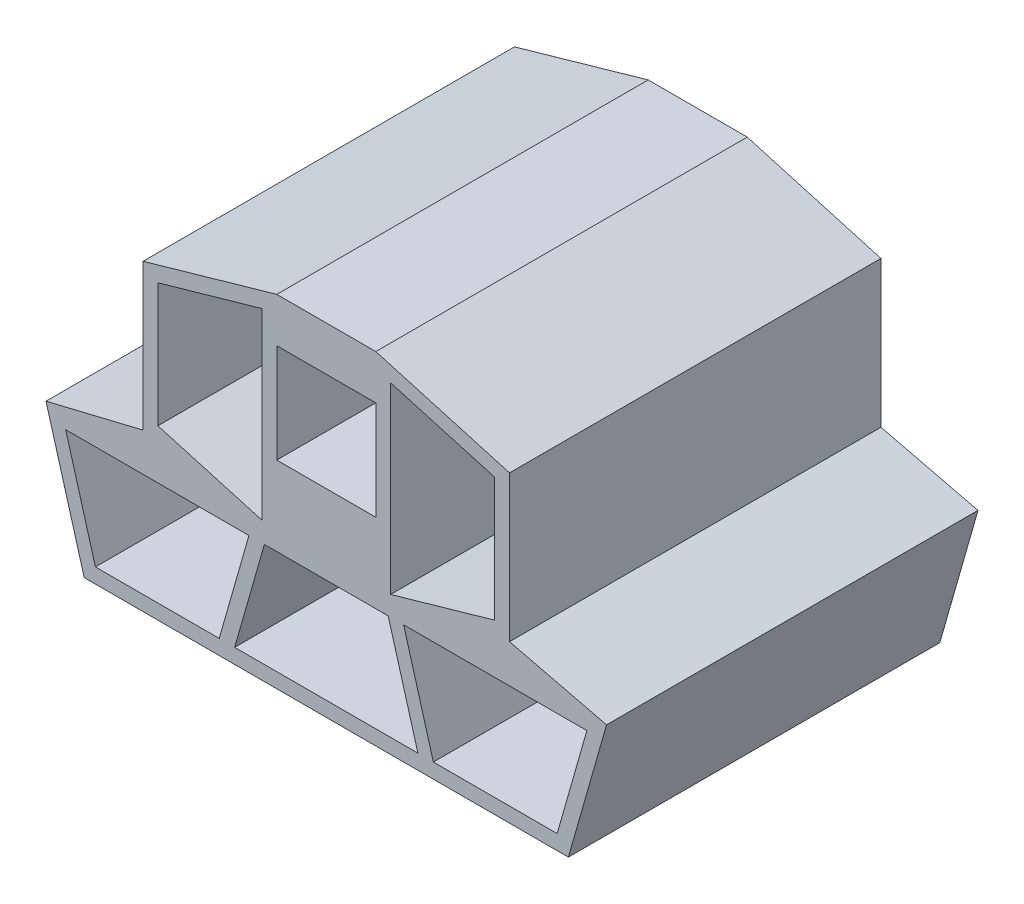
ISO-10303-21;
HEADER;
FILE_DESCRIPTION(('STEP AP214'),'2;1');
FILE_NAME('part.step','',(''),(''),'','','');
FILE_SCHEMA(('AUTOMOTIVE_DESIGN { 1 0 10303 214 1 1 1 1 }'));
ENDSEC;
DATA;
#1=APPLICATION_CONTEXT('core data for automotive mechanical design processes');
#2=APPLICATION_PROTOCOL_DEFINITION('international standard','automotive_design',2000,#1);
#3=PRODUCT_CONTEXT('',#1,'mechanical');
#4=PRODUCT('Part','Part','',(#3));
#5=PRODUCT_RELATED_PRODUCT_CATEGORY('part','',(#4));
#6=PRODUCT_DEFINITION_FORMATION('','',#4);
#7=PRODUCT_DEFINITION_CONTEXT('part definition',#1,'design');
#8=PRODUCT_DEFINITION('design','',#6,#7);
#9=PRODUCT_DEFINITION_SHAPE('','',#8);
#10=(LENGTH_UNIT() NAMED_UNIT(*) SI_UNIT(.MILLI.,.METRE.));
#11=(NAMED_UNIT(*) PLANE_ANGLE_UNIT() SI_UNIT($,.RADIAN.));
#12=(NAMED_UNIT(*) SI_UNIT($,.STERADIAN.) SOLID_ANGLE_UNIT());
#13=UNCERTAINTY_MEASURE_WITH_UNIT(LENGTH_MEASURE(1.E-05),#10,'distance_accuracy_value','');
#14=(GEOMETRIC_REPRESENTATION_CONTEXT(3) GLOBAL_UNCERTAINTY_ASSIGNED_CONTEXT((#13)) GLOBAL_UNIT_ASSIGNED_CONTEXT((#10,
#11,#12)) REPRESENTATION_CONTEXT('',''));
#15=CARTESIAN_POINT('',(0.,0.,0.));
#16=DIRECTION('',(0.,0.,1.));
#17=DIRECTION('',(1.,0.,0.));
#18=AXIS2_PLACEMENT_3D('',#15,#16,#17);
#19=CARTESIAN_POINT('',(0.,0.,75.));
#20=DIRECTION('',(0.,0.,1.));
#21=DIRECTION('',(1.,0.,0.));
#22=AXIS2_PLACEMENT_3D('',#19,#20,#21);
#23=PLANE('',#22);
#24=DIRECTION('',(-0.972006040902792,0.234955860638716,0.));
#25=VECTOR('',#24,1.);
#26=CARTESIAN_POINT('',(56.5972370479555,-23.,75.));
#27=LINE('',#26,#25);
#28=CARTESIAN_POINT('',(56.5972370479555,-23.,75.));
#29=VERTEX_POINT('',#28);
#30=CARTESIAN_POINT('',(37.,-18.2629042382631,75.));
#31=VERTEX_POINT('',#30);
#32=EDGE_CURVE('E524',#29,#31,#27,.T.);
#33=ORIENTED_EDGE('',*,*,#32,.T.);
#34=DIRECTION('',(0.,1.,0.));
#35=VECTOR('',#34,1.);
#36=CARTESIAN_POINT('',(37.,11.2629042382631,75.));
#37=LINE('',#36,#35);
#38=CARTESIAN_POINT('',(37.,11.2629042382631,75.));
#39=VERTEX_POINT('',#38);
#40=EDGE_CURVE('E528',#31,#39,#37,.T.);
#41=ORIENTED_EDGE('',*,*,#40,.T.);
#42=DIRECTION('',(-0.961523947640823,0.274721127897378,0.));
#43=VECTOR('',#42,1.);
#44=CARTESIAN_POINT('',(10.,18.9771899525488,75.));
#45=LINE('',#44,#43);
#46=CARTESIAN_POINT('',(10.,18.9771899525488,75.));
#47=VERTEX_POINT('',#46);
#48=EDGE_CURVE('E532',#39,#47,#45,.T.);
#49=ORIENTED_EDGE('',*,*,#48,.T.);
#50=DIRECTION('',(-1.,0.,0.));
#51=VECTOR('',#50,1.);
#52=CARTESIAN_POINT('',(10.,18.9771899525488,75.));
#53=LINE('',#52,#51);
#54=CARTESIAN_POINT('',(-10.,18.9771899525488,75.));
#55=VERTEX_POINT('',#54);
#56=EDGE_CURVE('E535',#47,#55,#53,.T.);
#57=ORIENTED_EDGE('',*,*,#56,.T.);
#58=DIRECTION('',(-0.961523947640823,-0.274721127897378,0.));
#59=VECTOR('',#58,1.);
#60=CARTESIAN_POINT('',(-10.,18.9771899525488,75.));
#61=LINE('',#60,#59);
#62=CARTESIAN_POINT('',(-37.,11.2629042382631,75.));
#63=VERTEX_POINT('',#62);
#64=EDGE_CURVE('E538',#55,#63,#61,.T.);
#65=ORIENTED_EDGE('',*,*,#64,.T.);
#66=DIRECTION('',(0.,-1.,0.));
#67=VECTOR('',#66,1.);
#68=CARTESIAN_POINT('',(-37.,11.2629042382631,75.));
#69=LINE('',#68,#67);
#70=CARTESIAN_POINT('',(-37.,-18.2629042382631,75.));
#71=VERTEX_POINT('',#70);
#72=EDGE_CURVE('E541',#63,#71,#69,.T.);
#73=ORIENTED_EDGE('',*,*,#72,.T.);
#74=DIRECTION('',(-0.972006040902792,-0.234955860638716,0.));
#75=VECTOR('',#74,1.);
#76=CARTESIAN_POINT('',(-56.5972370479555,-23.,75.));
#77=LINE('',#76,#75);
#78=CARTESIAN_POINT('',(-56.5972370479555,-23.,75.));
#79=VERTEX_POINT('',#78);
#80=EDGE_CURVE('E544',#71,#79,#77,.T.);
#81=ORIENTED_EDGE('',*,*,#80,.T.);
#82=DIRECTION('',(0.274721127897378,-0.961523947640823,0.));
#83=VECTOR('',#82,1.);
#84=CARTESIAN_POINT('',(-56.5972370479555,-23.,75.));
#85=LINE('',#84,#83);
#86=CARTESIAN_POINT('',(-48.8829513336697,-50.,75.));
#87=VERTEX_POINT('',#86);
#88=EDGE_CURVE('E547',#79,#87,#85,.T.);
#89=ORIENTED_EDGE('',*,*,#88,.T.);
#90=DIRECTION('',(1.,0.,0.));
#91=VECTOR('',#90,1.);
#92=CARTESIAN_POINT('',(-48.8829513336697,-50.,75.));
#93=LINE('',#92,#91);
#94=CARTESIAN_POINT('',(48.8829513336698,-50.,75.));
#95=VERTEX_POINT('',#94);
#96=EDGE_CURVE('E550',#87,#95,#93,.T.);
#97=ORIENTED_EDGE('',*,*,#96,.T.);
#98=DIRECTION('',(0.274721127897378,0.961523947640823,0.));
#99=VECTOR('',#98,1.);
#100=CARTESIAN_POINT('',(56.5972370479555,-23.,75.));
#101=LINE('',#100,#99);
#102=EDGE_CURVE('E553',#95,#29,#101,.T.);
#103=ORIENTED_EDGE('',*,*,#102,.T.);
#104=EDGE_LOOP('',(#33,#41,#49,#57,#65,#73,#81,#89,#97,#103));
#105=FACE_BOUND('',#104,.T.);
#106=DIRECTION('',(1.,0.,0.));
#107=VECTOR('',#106,1.);
#108=CARTESIAN_POINT('',(10.,-10.,75.));
#109=LINE('',#108,#107);
#110=CARTESIAN_POINT('',(-10.,-10.,75.));
#111=VERTEX_POINT('',#110);
#112=CARTESIAN_POINT('',(10.,-10.,75.));
#113=VERTEX_POINT('',#112);
#114=EDGE_CURVE('E484',#111,#113,#109,.T.);
#115=ORIENTED_EDGE('',*,*,#114,.F.);
#116=DIRECTION('',(0.,-1.,0.));
#117=VECTOR('',#116,1.);
#118=CARTESIAN_POINT('',(-10.,-10.,75.));
#119=LINE('',#118,#117);
#120=CARTESIAN_POINT('',(-10.,10.,75.));
#121=VERTEX_POINT('',#120);
#122=EDGE_CURVE('E481',#121,#111,#119,.T.);
#123=ORIENTED_EDGE('',*,*,#122,.F.);
#124=DIRECTION('',(-1.,0.,0.));
#125=VECTOR('',#124,1.);
#126=CARTESIAN_POINT('',(10.,10.,75.));
#127=LINE('',#126,#125);
#128=CARTESIAN_POINT('',(10.,10.,75.));
#129=VERTEX_POINT('',#128);
#130=EDGE_CURVE('E492',#129,#121,#127,.T.);
#131=ORIENTED_EDGE('',*,*,#130,.F.);
#132=DIRECTION('',(0.,1.,0.));
#133=VECTOR('',#132,1.);
#134=CARTESIAN_POINT('',(10.,-10.,75.));
#135=LINE('',#134,#133);
#136=EDGE_CURVE('E488',#113,#129,#135,.T.);
#137=ORIENTED_EDGE('',*,*,#136,.F.);
#138=EDGE_LOOP('',(#115,#123,#131,#137));
#139=FACE_BOUND('',#138,.T.);
#140=DIRECTION('',(0.274721127897378,-0.961523947640823,0.));
#141=VECTOR('',#140,1.);
#142=CARTESIAN_POINT('',(15.6200470954067,-26.,75.));
#143=LINE('',#142,#141);
#144=CARTESIAN_POINT('',(15.6200470954067,-26.,75.));
#145=VERTEX_POINT('',#144);
#146=CARTESIAN_POINT('',(21.6200470954067,-47.,75.));
#147=VERTEX_POINT('',#146);
#148=EDGE_CURVE('E441',#145,#147,#143,.T.);
#149=ORIENTED_EDGE('',*,*,#148,.F.);
#150=DIRECTION('',(-1.,0.,0.));
#151=VECTOR('',#150,1.);
#152=CARTESIAN_POINT('',(15.6200470954067,-26.,75.));
#153=LINE('',#152,#151);
#154=CARTESIAN_POINT('',(52.6200470954067,-26.,75.));
#155=VERTEX_POINT('',#154);
#156=EDGE_CURVE('E438',#155,#145,#153,.T.);
#157=ORIENTED_EDGE('',*,*,#156,.F.);
#158=DIRECTION('',(0.27472112789738,0.961523947640823,0.));
#159=VECTOR('',#158,1.);
#160=CARTESIAN_POINT('',(52.6200470954067,-26.,75.));
#161=LINE('',#160,#159);
#162=CARTESIAN_POINT('',(46.6200470954066,-47.,75.));
#163=VERTEX_POINT('',#162);
#164=EDGE_CURVE('E449',#163,#155,#161,.T.);
#165=ORIENTED_EDGE('',*,*,#164,.F.);
#166=DIRECTION('',(1.,0.,0.));
#167=VECTOR('',#166,1.);
#168=CARTESIAN_POINT('',(46.6200470954066,-47.,75.));
#169=LINE('',#168,#167);
#170=EDGE_CURVE('E445',#147,#163,#169,.T.);
#171=ORIENTED_EDGE('',*,*,#170,.F.);
#172=EDGE_LOOP('',(#149,#157,#165,#171));
#173=FACE_BOUND('',#172,.T.);
#174=DIRECTION('',(-1.,0.,0.));
#175=VECTOR('',#174,1.);
#176=CARTESIAN_POINT('',(-12.4999999999993,-26.,75.));
#177=LINE('',#176,#175);
#178=CARTESIAN_POINT('',(12.5000000000007,-26.,75.));
#179=VERTEX_POINT('',#178);
#180=CARTESIAN_POINT('',(-12.4999999999993,-26.,75.));
#181=VERTEX_POINT('',#180);
#182=EDGE_CURVE('E398',#179,#181,#177,.T.);
#183=ORIENTED_EDGE('',*,*,#182,.F.);
#184=DIRECTION('',(-0.274721127897378,0.961523947640823,0.));
#185=VECTOR('',#184,1.);
#186=CARTESIAN_POINT('',(12.5000000000007,-26.,75.));
#187=LINE('',#186,#185);
#188=CARTESIAN_POINT('',(18.5000000000007,-47.,75.));
#189=VERTEX_POINT('',#188);
#190=EDGE_CURVE('E395',#189,#179,#187,.T.);
#191=ORIENTED_EDGE('',*,*,#190,.F.);
#192=DIRECTION('',(1.,0.,0.));
#193=VECTOR('',#192,1.);
#194=CARTESIAN_POINT('',(-18.4999999999993,-47.,75.));
#195=LINE('',#194,#193);
#196=CARTESIAN_POINT('',(-18.4999999999993,-47.,75.));
#197=VERTEX_POINT('',#196);
#198=EDGE_CURVE('E406',#197,#189,#195,.T.);
#199=ORIENTED_EDGE('',*,*,#198,.F.);
#200=DIRECTION('',(-0.274721127897378,-0.961523947640823,0.));
#201=VECTOR('',#200,1.);
#202=CARTESIAN_POINT('',(-12.4999999999993,-26.,75.));
#203=LINE('',#202,#201);
#204=EDGE_CURVE('E402',#181,#197,#203,.T.);
#205=ORIENTED_EDGE('',*,*,#204,.F.);
#206=EDGE_LOOP('',(#183,#191,#199,#205));
#207=FACE_BOUND('',#206,.T.);
#208=DIRECTION('',(-1.,0.,0.));
#209=VECTOR('',#208,1.);
#210=CARTESIAN_POINT('',(-15.6200470954067,-26.,75.));
#211=LINE('',#210,#209);
#212=CARTESIAN_POINT('',(-15.6200470954067,-26.,75.));
#213=VERTEX_POINT('',#212);
#214=CARTESIAN_POINT('',(-52.6200470954067,-26.,75.));
#215=VERTEX_POINT('',#214);
#216=EDGE_CURVE('E355',#213,#215,#211,.T.);
#217=ORIENTED_EDGE('',*,*,#216,.F.);
#218=DIRECTION('',(0.274721127897378,0.961523947640823,0.));
#219=VECTOR('',#218,1.);
#220=CARTESIAN_POINT('',(-15.6200470954067,-26.,75.));
#221=LINE('',#220,#219);
#222=CARTESIAN_POINT('',(-21.6200470954066,-47.,75.));
#223=VERTEX_POINT('',#222);
#224=EDGE_CURVE('E352',#223,#213,#221,.T.);
#225=ORIENTED_EDGE('',*,*,#224,.F.);
#226=DIRECTION('',(1.,0.,0.));
#227=VECTOR('',#226,1.);
#228=CARTESIAN_POINT('',(-46.6200470954066,-47.,75.));
#229=LINE('',#228,#227);
#230=CARTESIAN_POINT('',(-46.6200470954066,-47.,75.));
#231=VERTEX_POINT('',#230);
#232=EDGE_CURVE('E363',#231,#223,#229,.T.);
#233=ORIENTED_EDGE('',*,*,#232,.F.);
#234=DIRECTION('',(0.27472112789738,-0.961523947640823,0.));
#235=VECTOR('',#234,1.);
#236=CARTESIAN_POINT('',(-52.6200470954067,-26.,75.));
#237=LINE('',#236,#235);
#238=EDGE_CURVE('E359',#215,#231,#237,.T.);
#239=ORIENTED_EDGE('',*,*,#238,.F.);
#240=EDGE_LOOP('',(#217,#225,#233,#239));
#241=FACE_BOUND('',#240,.T.);
#242=DIRECTION('',(0.,1.,0.));
#243=VECTOR('',#242,1.);
#244=CARTESIAN_POINT('',(-13.,-22.,75.));
#245=LINE('',#244,#243);
#246=CARTESIAN_POINT('',(-13.,-22.,75.));
#247=VERTEX_POINT('',#246);
#248=CARTESIAN_POINT('',(-13.,15.,75.));
#249=VERTEX_POINT('',#248);
#250=EDGE_CURVE('E312',#247,#249,#245,.T.);
#251=ORIENTED_EDGE('',*,*,#250,.F.);
#252=DIRECTION('',(0.961523947640823,-0.274721127897378,0.));
#253=VECTOR('',#252,1.);
#254=CARTESIAN_POINT('',(-34.,-16.,75.));
#255=LINE('',#254,#253);
#256=CARTESIAN_POINT('',(-34.,-16.,75.));
#257=VERTEX_POINT('',#256);
#258=EDGE_CURVE('E309',#257,#247,#255,.T.);
#259=ORIENTED_EDGE('',*,*,#258,.F.);
#260=DIRECTION('',(0.,-1.,0.));
#261=VECTOR('',#260,1.);
#262=CARTESIAN_POINT('',(-34.,9.,75.));
#263=LINE('',#262,#261);
#264=CARTESIAN_POINT('',(-34.,9.,75.));
#265=VERTEX_POINT('',#264);
#266=EDGE_CURVE('E320',#265,#257,#263,.T.);
#267=ORIENTED_EDGE('',*,*,#266,.F.);
#268=DIRECTION('',(-0.961523947640823,-0.274721127897378,0.));
#269=VECTOR('',#268,1.);
#270=CARTESIAN_POINT('',(-13.,15.,75.));
#271=LINE('',#270,#269);
#272=EDGE_CURVE('E316',#249,#265,#271,.T.);
#273=ORIENTED_EDGE('',*,*,#272,.F.);
#274=EDGE_LOOP('',(#251,#259,#267,#273));
#275=FACE_BOUND('',#274,.T.);
#276=DIRECTION('',(0.,-1.,0.));
#277=VECTOR('',#276,1.);
#278=CARTESIAN_POINT('',(13.,-22.,75.));
#279=LINE('',#278,#277);
#280=CARTESIAN_POINT('',(13.,15.,75.));
#281=VERTEX_POINT('',#280);
#282=CARTESIAN_POINT('',(13.,-22.,75.));
#283=VERTEX_POINT('',#282);
#284=EDGE_CURVE('E270',#281,#283,#279,.T.);
#285=ORIENTED_EDGE('',*,*,#284,.F.);
#286=DIRECTION('',(-0.961523947640823,0.274721127897377,0.));
#287=VECTOR('',#286,1.);
#288=CARTESIAN_POINT('',(13.,15.,75.));
#289=LINE('',#288,#287);
#290=CARTESIAN_POINT('',(34.,9.00000000000001,75.));
#291=VERTEX_POINT('',#290);
#292=EDGE_CURVE('E261',#291,#281,#289,.T.);
#293=ORIENTED_EDGE('',*,*,#292,.F.);
#294=DIRECTION('',(0.,1.,0.));
#295=VECTOR('',#294,1.);
#296=CARTESIAN_POINT('',(34.,9.00000000000001,75.));
#297=LINE('',#296,#295);
#298=CARTESIAN_POINT('',(34.,-16.,75.));
#299=VERTEX_POINT('',#298);
#300=EDGE_CURVE('E287',#299,#291,#297,.T.);
#301=ORIENTED_EDGE('',*,*,#300,.F.);
#302=DIRECTION('',(0.961523947640823,0.274721127897378,0.));
#303=VECTOR('',#302,1.);
#304=CARTESIAN_POINT('',(34.,-16.,75.));
#305=LINE('',#304,#303);
#306=EDGE_CURVE('E283',#283,#299,#305,.T.);
#307=ORIENTED_EDGE('',*,*,#306,.F.);
#308=EDGE_LOOP('',(#285,#293,#301,#307));
#309=FACE_BOUND('',#308,.T.);
#310=ADVANCED_FACE('F39',(#105,#139,#173,#207,#241,#275,#309),#23,.T.);
#311=CARTESIAN_POINT('',(0.,0.,0.));
#312=DIRECTION('',(0.,0.,1.));
#313=DIRECTION('',(1.,0.,0.));
#314=AXIS2_PLACEMENT_3D('',#311,#312,#313);
#315=PLANE('',#314);
#316=DIRECTION('',(0.961523947640823,-0.274721127897378,0.));
#317=VECTOR('',#316,1.);
#318=CARTESIAN_POINT('',(-34.,-16.,0.));
#319=LINE('',#318,#317);
#320=CARTESIAN_POINT('',(-34.,-16.,0.));
#321=VERTEX_POINT('',#320);
#322=CARTESIAN_POINT('',(-13.,-22.,0.));
#323=VERTEX_POINT('',#322);
#324=EDGE_CURVE('E279',#321,#323,#319,.T.);
#325=ORIENTED_EDGE('',*,*,#324,.T.);
#326=DIRECTION('',(0.,1.,0.));
#327=VECTOR('',#326,1.);
#328=CARTESIAN_POINT('',(-13.,-22.,0.));
#329=LINE('',#328,#327);
#330=CARTESIAN_POINT('',(-13.,15.,0.));
#331=VERTEX_POINT('',#330);
#332=EDGE_CURVE('E327',#323,#331,#329,.T.);
#333=ORIENTED_EDGE('',*,*,#332,.T.);
#334=DIRECTION('',(-0.961523947640823,-0.274721127897378,0.));
#335=VECTOR('',#334,1.);
#336=CARTESIAN_POINT('',(-13.,15.,0.));
#337=LINE('',#336,#335);
#338=CARTESIAN_POINT('',(-34.,9.,0.));
#339=VERTEX_POINT('',#338);
#340=EDGE_CURVE('E331',#331,#339,#337,.T.);
#341=ORIENTED_EDGE('',*,*,#340,.T.);
#342=DIRECTION('',(0.,-1.,0.));
#343=VECTOR('',#342,1.);
#344=CARTESIAN_POINT('',(-34.,9.,0.));
#345=LINE('',#344,#343);
#346=EDGE_CURVE('E313',#339,#321,#345,.T.);
#347=ORIENTED_EDGE('',*,*,#346,.T.);
#348=EDGE_LOOP('',(#325,#333,#341,#347));
#349=FACE_BOUND('',#348,.T.);
#350=DIRECTION('',(-0.274721127897378,0.961523947640823,0.));
#351=VECTOR('',#350,1.);
#352=CARTESIAN_POINT('',(12.5000000000007,-26.,0.));
#353=LINE('',#352,#351);
#354=CARTESIAN_POINT('',(18.5000000000007,-47.,0.));
#355=VERTEX_POINT('',#354);
#356=CARTESIAN_POINT('',(12.5000000000007,-26.,0.));
#357=VERTEX_POINT('',#356);
#358=EDGE_CURVE('E394',#355,#357,#353,.T.);
#359=ORIENTED_EDGE('',*,*,#358,.T.);
#360=DIRECTION('',(-1.,0.,0.));
#361=VECTOR('',#360,1.);
#362=CARTESIAN_POINT('',(-12.4999999999993,-26.,0.));
#363=LINE('',#362,#361);
#364=CARTESIAN_POINT('',(-12.4999999999993,-26.,0.));
#365=VERTEX_POINT('',#364);
#366=EDGE_CURVE('E413',#357,#365,#363,.T.);
#367=ORIENTED_EDGE('',*,*,#366,.T.);
#368=DIRECTION('',(-0.274721127897378,-0.961523947640823,0.));
#369=VECTOR('',#368,1.);
#370=CARTESIAN_POINT('',(-12.4999999999993,-26.,0.));
#371=LINE('',#370,#369);
#372=CARTESIAN_POINT('',(-18.4999999999993,-47.,0.));
#373=VERTEX_POINT('',#372);
#374=EDGE_CURVE('E417',#365,#373,#371,.T.);
#375=ORIENTED_EDGE('',*,*,#374,.T.);
#376=DIRECTION('',(1.,0.,0.));
#377=VECTOR('',#376,1.);
#378=CARTESIAN_POINT('',(-18.4999999999993,-47.,0.));
#379=LINE('',#378,#377);
#380=EDGE_CURVE('E399',#373,#355,#379,.T.);
#381=ORIENTED_EDGE('',*,*,#380,.T.);
#382=EDGE_LOOP('',(#359,#367,#375,#381));
#383=FACE_BOUND('',#382,.T.);
#384=DIRECTION('',(0.,-1.,0.));
#385=VECTOR('',#384,1.);
#386=CARTESIAN_POINT('',(-10.,-10.,0.));
#387=LINE('',#386,#385);
#388=CARTESIAN_POINT('',(-10.,10.,0.));
#389=VERTEX_POINT('',#388);
#390=CARTESIAN_POINT('',(-10.,-10.,0.));
#391=VERTEX_POINT('',#390);
#392=EDGE_CURVE('E480',#389,#391,#387,.T.);
#393=ORIENTED_EDGE('',*,*,#392,.T.);
#394=DIRECTION('',(1.,0.,0.));
#395=VECTOR('',#394,1.);
#396=CARTESIAN_POINT('',(10.,-10.,0.));
#397=LINE('',#396,#395);
#398=CARTESIAN_POINT('',(10.,-10.,0.));
#399=VERTEX_POINT('',#398);
#400=EDGE_CURVE('E499',#391,#399,#397,.T.);
#401=ORIENTED_EDGE('',*,*,#400,.T.);
#402=DIRECTION('',(0.,1.,0.));
#403=VECTOR('',#402,1.);
#404=CARTESIAN_POINT('',(10.,-10.,0.));
#405=LINE('',#404,#403);
#406=CARTESIAN_POINT('',(10.,10.,0.));
#407=VERTEX_POINT('',#406);
#408=EDGE_CURVE('E503',#399,#407,#405,.T.);
#409=ORIENTED_EDGE('',*,*,#408,.T.);
#410=DIRECTION('',(-1.,0.,0.));
#411=VECTOR('',#410,1.);
#412=CARTESIAN_POINT('',(10.,10.,0.));
#413=LINE('',#412,#411);
#414=EDGE_CURVE('E485',#407,#389,#413,.T.);
#415=ORIENTED_EDGE('',*,*,#414,.T.);
#416=EDGE_LOOP('',(#393,#401,#409,#415));
#417=FACE_BOUND('',#416,.T.);
#418=DIRECTION('',(-0.972006040902792,0.234955860638716,0.));
#419=VECTOR('',#418,1.);
#420=CARTESIAN_POINT('',(56.5972370479555,-23.,0.));
#421=LINE('',#420,#419);
#422=CARTESIAN_POINT('',(56.5972370479555,-23.,0.));
#423=VERTEX_POINT('',#422);
#424=CARTESIAN_POINT('',(37.,-18.2629042382631,0.));
#425=VERTEX_POINT('',#424);
#426=EDGE_CURVE('E523',#423,#425,#421,.T.);
#427=ORIENTED_EDGE('',*,*,#426,.F.);
#428=DIRECTION('',(0.274721127897378,0.961523947640823,0.));
#429=VECTOR('',#428,1.);
#430=CARTESIAN_POINT('',(56.5972370479555,-23.,0.));
#431=LINE('',#430,#429);
#432=CARTESIAN_POINT('',(48.8829513336698,-50.,0.));
#433=VERTEX_POINT('',#432);
#434=EDGE_CURVE('E529',#433,#423,#431,.T.);
#435=ORIENTED_EDGE('',*,*,#434,.F.);
#436=DIRECTION('',(1.,0.,0.));
#437=VECTOR('',#436,1.);
#438=CARTESIAN_POINT('',(-48.8829513336697,-50.,0.));
#439=LINE('',#438,#437);
#440=CARTESIAN_POINT('',(-48.8829513336697,-50.,0.));
#441=VERTEX_POINT('',#440);
#442=EDGE_CURVE('E582',#441,#433,#439,.T.);
#443=ORIENTED_EDGE('',*,*,#442,.F.);
#444=DIRECTION('',(0.274721127897378,-0.961523947640823,0.));
#445=VECTOR('',#444,1.);
#446=CARTESIAN_POINT('',(-56.5972370479555,-23.,0.));
#447=LINE('',#446,#445);
#448=CARTESIAN_POINT('',(-56.5972370479555,-23.,0.));
#449=VERTEX_POINT('',#448);
#450=EDGE_CURVE('E579',#449,#441,#447,.T.);
#451=ORIENTED_EDGE('',*,*,#450,.F.);
#452=DIRECTION('',(-0.972006040902792,-0.234955860638716,0.));
#453=VECTOR('',#452,1.);
#454=CARTESIAN_POINT('',(-56.5972370479555,-23.,0.));
#455=LINE('',#454,#453);
#456=CARTESIAN_POINT('',(-37.,-18.2629042382631,0.));
#457=VERTEX_POINT('',#456);
#458=EDGE_CURVE('E576',#457,#449,#455,.T.);
#459=ORIENTED_EDGE('',*,*,#458,.F.);
#460=DIRECTION('',(0.,-1.,0.));
#461=VECTOR('',#460,1.);
#462=CARTESIAN_POINT('',(-37.,11.2629042382631,0.));
#463=LINE('',#462,#461);
#464=CARTESIAN_POINT('',(-37.,11.2629042382631,0.));
#465=VERTEX_POINT('',#464);
#466=EDGE_CURVE('E573',#465,#457,#463,.T.);
#467=ORIENTED_EDGE('',*,*,#466,.F.);
#468=DIRECTION('',(-0.961523947640823,-0.274721127897378,0.));
#469=VECTOR('',#468,1.);
#470=CARTESIAN_POINT('',(-10.,18.9771899525488,0.));
#471=LINE('',#470,#469);
#472=CARTESIAN_POINT('',(-10.,18.9771899525488,0.));
#473=VERTEX_POINT('',#472);
#474=EDGE_CURVE('E570',#473,#465,#471,.T.);
#475=ORIENTED_EDGE('',*,*,#474,.F.);
#476=DIRECTION('',(-1.,0.,0.));
#477=VECTOR('',#476,1.);
#478=CARTESIAN_POINT('',(-10.,18.9771899525488,0.));
#479=LINE('',#478,#477);
#480=CARTESIAN_POINT('',(10.,18.9771899525488,0.));
#481=VERTEX_POINT('',#480);
#482=EDGE_CURVE('E567',#481,#473,#479,.T.);
#483=ORIENTED_EDGE('',*,*,#482,.F.);
#484=DIRECTION('',(-0.961523947640823,0.274721127897378,0.));
#485=VECTOR('',#484,1.);
#486=CARTESIAN_POINT('',(10.,18.9771899525488,0.));
#487=LINE('',#486,#485);
#488=CARTESIAN_POINT('',(37.,11.2629042382631,0.));
#489=VERTEX_POINT('',#488);
#490=EDGE_CURVE('E563',#489,#481,#487,.T.);
#491=ORIENTED_EDGE('',*,*,#490,.F.);
#492=DIRECTION('',(0.,1.,0.));
#493=VECTOR('',#492,1.);
#494=CARTESIAN_POINT('',(37.,11.2629042382631,0.));
#495=LINE('',#494,#493);
#496=EDGE_CURVE('E560',#425,#489,#495,.T.);
#497=ORIENTED_EDGE('',*,*,#496,.F.);
#498=EDGE_LOOP('',(#427,#435,#443,#451,#459,#467,#475,#483,#491,#497));
#499=FACE_BOUND('',#498,.T.);
#500=DIRECTION('',(-1.,0.,0.));
#501=VECTOR('',#500,1.);
#502=CARTESIAN_POINT('',(15.6200470954067,-26.,0.));
#503=LINE('',#502,#501);
#504=CARTESIAN_POINT('',(52.6200470954067,-26.,0.));
#505=VERTEX_POINT('',#504);
#506=CARTESIAN_POINT('',(15.6200470954067,-26.,0.));
#507=VERTEX_POINT('',#506);
#508=EDGE_CURVE('E437',#505,#507,#503,.T.);
#509=ORIENTED_EDGE('',*,*,#508,.T.);
#510=DIRECTION('',(0.274721127897378,-0.961523947640823,0.));
#511=VECTOR('',#510,1.);
#512=CARTESIAN_POINT('',(15.6200470954067,-26.,0.));
#513=LINE('',#512,#511);
#514=CARTESIAN_POINT('',(21.6200470954067,-47.,0.));
#515=VERTEX_POINT('',#514);
#516=EDGE_CURVE('E456',#507,#515,#513,.T.);
#517=ORIENTED_EDGE('',*,*,#516,.T.);
#518=DIRECTION('',(1.,0.,0.));
#519=VECTOR('',#518,1.);
#520=CARTESIAN_POINT('',(46.6200470954066,-47.,0.));
#521=LINE('',#520,#519);
#522=CARTESIAN_POINT('',(46.6200470954066,-47.,0.));
#523=VERTEX_POINT('',#522);
#524=EDGE_CURVE('E460',#515,#523,#521,.T.);
#525=ORIENTED_EDGE('',*,*,#524,.T.);
#526=DIRECTION('',(0.27472112789738,0.961523947640823,0.));
#527=VECTOR('',#526,1.);
#528=CARTESIAN_POINT('',(52.6200470954067,-26.,0.));
#529=LINE('',#528,#527);
#530=EDGE_CURVE('E442',#523,#505,#529,.T.);
#531=ORIENTED_EDGE('',*,*,#530,.T.);
#532=EDGE_LOOP('',(#509,#517,#525,#531));
#533=FACE_BOUND('',#532,.T.);
#534=DIRECTION('',(0.274721127897378,0.961523947640823,0.));
#535=VECTOR('',#534,1.);
#536=CARTESIAN_POINT('',(-15.6200470954067,-26.,0.));
#537=LINE('',#536,#535);
#538=CARTESIAN_POINT('',(-21.6200470954066,-47.,0.));
#539=VERTEX_POINT('',#538);
#540=CARTESIAN_POINT('',(-15.6200470954067,-26.,0.));
#541=VERTEX_POINT('',#540);
#542=EDGE_CURVE('E351',#539,#541,#537,.T.);
#543=ORIENTED_EDGE('',*,*,#542,.T.);
#544=DIRECTION('',(-1.,0.,0.));
#545=VECTOR('',#544,1.);
#546=CARTESIAN_POINT('',(-15.6200470954067,-26.,0.));
#547=LINE('',#546,#545);
#548=CARTESIAN_POINT('',(-52.6200470954067,-26.,0.));
#549=VERTEX_POINT('',#548);
#550=EDGE_CURVE('E370',#541,#549,#547,.T.);
#551=ORIENTED_EDGE('',*,*,#550,.T.);
#552=DIRECTION('',(0.27472112789738,-0.961523947640823,0.));
#553=VECTOR('',#552,1.);
#554=CARTESIAN_POINT('',(-52.6200470954067,-26.,0.));
#555=LINE('',#554,#553);
#556=CARTESIAN_POINT('',(-46.6200470954066,-47.,0.));
#557=VERTEX_POINT('',#556);
#558=EDGE_CURVE('E374',#549,#557,#555,.T.);
#559=ORIENTED_EDGE('',*,*,#558,.T.);
#560=DIRECTION('',(1.,0.,0.));
#561=VECTOR('',#560,1.);
#562=CARTESIAN_POINT('',(-46.6200470954066,-47.,0.));
#563=LINE('',#562,#561);
#564=EDGE_CURVE('E356',#557,#539,#563,.T.);
#565=ORIENTED_EDGE('',*,*,#564,.T.);
#566=EDGE_LOOP('',(#543,#551,#559,#565));
#567=FACE_BOUND('',#566,.T.);
#568=DIRECTION('',(-0.961523947640823,0.274721127897377,0.));
#569=VECTOR('',#568,1.);
#570=CARTESIAN_POINT('',(13.,15.,0.));
#571=LINE('',#570,#569);
#572=CARTESIAN_POINT('',(34.,9.00000000000001,0.));
#573=VERTEX_POINT('',#572);
#574=CARTESIAN_POINT('',(13.,15.,0.));
#575=VERTEX_POINT('',#574);
#576=EDGE_CURVE('E63',#573,#575,#571,.T.);
#577=ORIENTED_EDGE('',*,*,#576,.T.);
#578=DIRECTION('',(0.,-1.,0.));
#579=VECTOR('',#578,1.);
#580=CARTESIAN_POINT('',(13.,-22.,0.));
#581=LINE('',#580,#579);
#582=CARTESIAN_POINT('',(13.,-22.,0.));
#583=VERTEX_POINT('',#582);
#584=EDGE_CURVE('E277',#575,#583,#581,.T.);
#585=ORIENTED_EDGE('',*,*,#584,.T.);
#586=DIRECTION('',(0.961523947640823,0.274721127897378,0.));
#587=VECTOR('',#586,1.);
#588=CARTESIAN_POINT('',(34.,-16.,0.));
#589=LINE('',#588,#587);
#590=CARTESIAN_POINT('',(34.,-16.,0.));
#591=VERTEX_POINT('',#590);
#592=EDGE_CURVE('E296',#583,#591,#589,.T.);
#593=ORIENTED_EDGE('',*,*,#592,.T.);
#594=DIRECTION('',(0.,1.,0.));
#595=VECTOR('',#594,1.);
#596=CARTESIAN_POINT('',(34.,9.00000000000001,0.));
#597=LINE('',#596,#595);
#598=EDGE_CURVE('E271',#591,#573,#597,.T.);
#599=ORIENTED_EDGE('',*,*,#598,.T.);
#600=EDGE_LOOP('',(#577,#585,#593,#599));
#601=FACE_BOUND('',#600,.T.);
#602=ADVANCED_FACE('F628',(#349,#383,#417,#499,#533,#567,#601),#315,.F.);
#603=CARTESIAN_POINT('',(56.5972370479555,-23.,75.));
#604=DIRECTION('',(-0.234955860638716,-0.972006040902792,0.));
#605=DIRECTION('',(0.972006040902792,-0.234955860638716,0.));
#606=AXIS2_PLACEMENT_3D('',#603,#604,#605);
#607=PLANE('',#606);
#608=ORIENTED_EDGE('',*,*,#426,.T.);
#609=DIRECTION('',(0.,0.,-1.));
#610=VECTOR('',#609,1.);
#611=CARTESIAN_POINT('',(37.,-18.2629042382631,75.));
#612=LINE('',#611,#610);
#613=EDGE_CURVE('E11',#31,#425,#612,.T.);
#614=ORIENTED_EDGE('',*,*,#613,.F.);
#615=ORIENTED_EDGE('',*,*,#32,.F.);
#616=DIRECTION('',(0.,0.,-1.));
#617=VECTOR('',#616,1.);
#618=CARTESIAN_POINT('',(56.5972370479555,-23.,75.));
#619=LINE('',#618,#617);
#620=EDGE_CURVE('E556',#29,#423,#619,.T.);
#621=ORIENTED_EDGE('',*,*,#620,.T.);
#622=EDGE_LOOP('',(#608,#614,#615,#621));
#623=FACE_BOUND('',#622,.T.);
#624=ADVANCED_FACE('F41',(#623),#607,.F.);
#625=CARTESIAN_POINT('',(37.,11.2629042382631,75.));
#626=DIRECTION('',(-1.,0.,0.));
#627=DIRECTION('',(0.,-1.,0.));
#628=AXIS2_PLACEMENT_3D('',#625,#626,#627);
#629=PLANE('',#628);
#630=ORIENTED_EDGE('',*,*,#496,.T.);
#631=DIRECTION('',(0.,0.,-1.));
#632=VECTOR('',#631,1.);
#633=CARTESIAN_POINT('',(37.,11.2629042382631,75.));
#634=LINE('',#633,#632);
#635=EDGE_CURVE('E48',#39,#489,#634,.T.);
#636=ORIENTED_EDGE('',*,*,#635,.F.);
#637=ORIENTED_EDGE('',*,*,#40,.F.);
#638=ORIENTED_EDGE('',*,*,#613,.T.);
#639=EDGE_LOOP('',(#630,#636,#637,#638));
#640=FACE_BOUND('',#639,.T.);
#641=ADVANCED_FACE('F646',(#640),#629,.F.);
#642=CARTESIAN_POINT('',(10.,18.9771899525488,75.));
#643=DIRECTION('',(-0.274721127897378,-0.961523947640823,0.));
#644=DIRECTION('',(0.961523947640823,-0.274721127897378,0.));
#645=AXIS2_PLACEMENT_3D('',#642,#643,#644);
#646=PLANE('',#645);
#647=ORIENTED_EDGE('',*,*,#490,.T.);
#648=DIRECTION('',(0.,0.,-1.));
#649=VECTOR('',#648,1.);
#650=CARTESIAN_POINT('',(10.,18.9771899525488,75.));
#651=LINE('',#650,#649);
#652=EDGE_CURVE('E614',#47,#481,#651,.T.);
#653=ORIENTED_EDGE('',*,*,#652,.F.);
#654=ORIENTED_EDGE('',*,*,#48,.F.);
#655=ORIENTED_EDGE('',*,*,#635,.T.);
#656=EDGE_LOOP('',(#647,#653,#654,#655));
#657=FACE_BOUND('',#656,.T.);
#658=ADVANCED_FACE('F623',(#657),#646,.F.);
#659=CARTESIAN_POINT('',(-10.,18.9771899525488,75.));
#660=DIRECTION('',(0.,-1.,0.));
#661=DIRECTION('',(1.,0.,0.));
#662=AXIS2_PLACEMENT_3D('',#659,#660,#661);
#663=PLANE('',#662);
#664=ORIENTED_EDGE('',*,*,#482,.T.);
#665=DIRECTION('',(0.,0.,-1.));
#666=VECTOR('',#665,1.);
#667=CARTESIAN_POINT('',(-10.,18.9771899525488,75.));
#668=LINE('',#667,#666);
#669=EDGE_CURVE('E610',#55,#473,#668,.T.);
#670=ORIENTED_EDGE('',*,*,#669,.F.);
#671=ORIENTED_EDGE('',*,*,#56,.F.);
#672=ORIENTED_EDGE('',*,*,#652,.T.);
#673=EDGE_LOOP('',(#664,#670,#671,#672));
#674=FACE_BOUND('',#673,.T.);
#675=ADVANCED_FACE('F634',(#674),#663,.F.);
#676=CARTESIAN_POINT('',(-10.,18.9771899525488,75.));
#677=DIRECTION('',(0.274721127897378,-0.961523947640823,0.));
#678=DIRECTION('',(0.961523947640823,0.274721127897378,0.));
#679=AXIS2_PLACEMENT_3D('',#676,#677,#678);
#680=PLANE('',#679);
#681=ORIENTED_EDGE('',*,*,#474,.T.);
#682=DIRECTION('',(0.,0.,-1.));
#683=VECTOR('',#682,1.);
#684=CARTESIAN_POINT('',(-37.,11.2629042382631,75.));
#685=LINE('',#684,#683);
#686=EDGE_CURVE('E606',#63,#465,#685,.T.);
#687=ORIENTED_EDGE('',*,*,#686,.F.);
#688=ORIENTED_EDGE('',*,*,#64,.F.);
#689=ORIENTED_EDGE('',*,*,#669,.T.);
#690=EDGE_LOOP('',(#681,#687,#688,#689));
#691=FACE_BOUND('',#690,.T.);
#692=ADVANCED_FACE('F638',(#691),#680,.F.);
#693=CARTESIAN_POINT('',(-37.,11.2629042382631,75.));
#694=DIRECTION('',(1.,0.,0.));
#695=DIRECTION('',(0.,1.,0.));
#696=AXIS2_PLACEMENT_3D('',#693,#694,#695);
#697=PLANE('',#696);
#698=ORIENTED_EDGE('',*,*,#466,.T.);
#699=DIRECTION('',(0.,0.,-1.));
#700=VECTOR('',#699,1.);
#701=CARTESIAN_POINT('',(-37.,-18.2629042382631,75.));
#702=LINE('',#701,#700);
#703=EDGE_CURVE('E602',#71,#457,#702,.T.);
#704=ORIENTED_EDGE('',*,*,#703,.F.);
#705=ORIENTED_EDGE('',*,*,#72,.F.);
#706=ORIENTED_EDGE('',*,*,#686,.T.);
#707=EDGE_LOOP('',(#698,#704,#705,#706));
#708=FACE_BOUND('',#707,.T.);
#709=ADVANCED_FACE('F669',(#708),#697,.F.);
#710=CARTESIAN_POINT('',(-56.5972370479555,-23.,75.));
#711=DIRECTION('',(0.234955860638716,-0.972006040902792,0.));
#712=DIRECTION('',(0.972006040902792,0.234955860638716,0.));
#713=AXIS2_PLACEMENT_3D('',#710,#711,#712);
#714=PLANE('',#713);
#715=ORIENTED_EDGE('',*,*,#458,.T.);
#716=DIRECTION('',(0.,0.,-1.));
#717=VECTOR('',#716,1.);
#718=CARTESIAN_POINT('',(-56.5972370479555,-23.,75.));
#719=LINE('',#718,#717);
#720=EDGE_CURVE('E598',#79,#449,#719,.T.);
#721=ORIENTED_EDGE('',*,*,#720,.F.);
#722=ORIENTED_EDGE('',*,*,#80,.F.);
#723=ORIENTED_EDGE('',*,*,#703,.T.);
#724=EDGE_LOOP('',(#715,#721,#722,#723));
#725=FACE_BOUND('',#724,.T.);
#726=ADVANCED_FACE('F666',(#725),#714,.F.);
#727=CARTESIAN_POINT('',(-56.5972370479555,-23.,75.));
#728=DIRECTION('',(0.961523947640823,0.274721127897378,0.));
#729=DIRECTION('',(-0.274721127897378,0.961523947640823,0.));
#730=AXIS2_PLACEMENT_3D('',#727,#728,#729);
#731=PLANE('',#730);
#732=ORIENTED_EDGE('',*,*,#450,.T.);
#733=DIRECTION('',(0.,0.,-1.));
#734=VECTOR('',#733,1.);
#735=CARTESIAN_POINT('',(-48.8829513336697,-50.,75.));
#736=LINE('',#735,#734);
#737=EDGE_CURVE('E594',#87,#441,#736,.T.);
#738=ORIENTED_EDGE('',*,*,#737,.F.);
#739=ORIENTED_EDGE('',*,*,#88,.F.);
#740=ORIENTED_EDGE('',*,*,#720,.T.);
#741=EDGE_LOOP('',(#732,#738,#739,#740));
#742=FACE_BOUND('',#741,.T.);
#743=ADVANCED_FACE('F662',(#742),#731,.F.);
#744=CARTESIAN_POINT('',(-48.8829513336697,-50.,75.));
#745=DIRECTION('',(0.,1.,0.));
#746=DIRECTION('',(-1.,0.,0.));
#747=AXIS2_PLACEMENT_3D('',#744,#745,#746);
#748=PLANE('',#747);
#749=ORIENTED_EDGE('',*,*,#442,.T.);
#750=DIRECTION('',(0.,0.,-1.));
#751=VECTOR('',#750,1.);
#752=CARTESIAN_POINT('',(48.8829513336698,-50.,75.));
#753=LINE('',#752,#751);
#754=EDGE_CURVE('E590',#95,#433,#753,.T.);
#755=ORIENTED_EDGE('',*,*,#754,.F.);
#756=ORIENTED_EDGE('',*,*,#96,.F.);
#757=ORIENTED_EDGE('',*,*,#737,.T.);
#758=EDGE_LOOP('',(#749,#755,#756,#757));
#759=FACE_BOUND('',#758,.T.);
#760=ADVANCED_FACE('F658',(#759),#748,.F.);
#761=CARTESIAN_POINT('',(56.5972370479555,-23.,75.));
#762=DIRECTION('',(-0.961523947640823,0.274721127897378,0.));
#763=DIRECTION('',(-0.274721127897378,-0.961523947640823,0.));
#764=AXIS2_PLACEMENT_3D('',#761,#762,#763);
#765=PLANE('',#764);
#766=ORIENTED_EDGE('',*,*,#434,.T.);
#767=ORIENTED_EDGE('',*,*,#620,.F.);
#768=ORIENTED_EDGE('',*,*,#102,.F.);
#769=ORIENTED_EDGE('',*,*,#754,.T.);
#770=EDGE_LOOP('',(#766,#767,#768,#769));
#771=FACE_BOUND('',#770,.T.);
#772=ADVANCED_FACE('F653',(#771),#765,.F.);
#773=CARTESIAN_POINT('',(-10.,-10.,75.));
#774=DIRECTION('',(1.,0.,0.));
#775=DIRECTION('',(0.,0.,-1.));
#776=AXIS2_PLACEMENT_3D('',#773,#774,#775);
#777=PLANE('',#776);
#778=ORIENTED_EDGE('',*,*,#392,.F.);
#779=DIRECTION('',(0.,0.,-1.));
#780=VECTOR('',#779,1.);
#781=CARTESIAN_POINT('',(-10.,10.,75.));
#782=LINE('',#781,#780);
#783=EDGE_CURVE('E495',#121,#389,#782,.T.);
#784=ORIENTED_EDGE('',*,*,#783,.F.);
#785=ORIENTED_EDGE('',*,*,#122,.T.);
#786=DIRECTION('',(0.,0.,-1.));
#787=VECTOR('',#786,1.);
#788=CARTESIAN_POINT('',(-10.,-10.,75.));
#789=LINE('',#788,#787);
#790=EDGE_CURVE('E519',#111,#391,#789,.T.);
#791=ORIENTED_EDGE('',*,*,#790,.T.);
#792=EDGE_LOOP('',(#778,#784,#785,#791));
#793=FACE_BOUND('',#792,.T.);
#794=ADVANCED_FACE('F686',(#793),#777,.T.);
#795=CARTESIAN_POINT('',(10.,-10.,75.));
#796=DIRECTION('',(0.,1.,0.));
#797=DIRECTION('',(-1.,0.,0.));
#798=AXIS2_PLACEMENT_3D('',#795,#796,#797);
#799=PLANE('',#798);
#800=ORIENTED_EDGE('',*,*,#400,.F.);
#801=ORIENTED_EDGE('',*,*,#790,.F.);
#802=ORIENTED_EDGE('',*,*,#114,.T.);
#803=DIRECTION('',(0.,0.,-1.));
#804=VECTOR('',#803,1.);
#805=CARTESIAN_POINT('',(10.,-10.,75.));
#806=LINE('',#805,#804);
#807=EDGE_CURVE('E516',#113,#399,#806,.T.);
#808=ORIENTED_EDGE('',*,*,#807,.T.);
#809=EDGE_LOOP('',(#800,#801,#802,#808));
#810=FACE_BOUND('',#809,.T.);
#811=ADVANCED_FACE('F712',(#810),#799,.T.);
#812=CARTESIAN_POINT('',(10.,-10.,75.));
#813=DIRECTION('',(-1.,0.,0.));
#814=DIRECTION('',(0.,0.,1.));
#815=AXIS2_PLACEMENT_3D('',#812,#813,#814);
#816=PLANE('',#815);
#817=ORIENTED_EDGE('',*,*,#408,.F.);
#818=ORIENTED_EDGE('',*,*,#807,.F.);
#819=ORIENTED_EDGE('',*,*,#136,.T.);
#820=DIRECTION('',(0.,0.,-1.));
#821=VECTOR('',#820,1.);
#822=CARTESIAN_POINT('',(10.,10.,75.));
#823=LINE('',#822,#821);
#824=EDGE_CURVE('E513',#129,#407,#823,.T.);
#825=ORIENTED_EDGE('',*,*,#824,.T.);
#826=EDGE_LOOP('',(#817,#818,#819,#825));
#827=FACE_BOUND('',#826,.T.);
#828=ADVANCED_FACE('F719',(#827),#816,.T.);
#829=CARTESIAN_POINT('',(10.,10.,75.));
#830=DIRECTION('',(0.,-1.,0.));
#831=DIRECTION('',(1.,0.,0.));
#832=AXIS2_PLACEMENT_3D('',#829,#830,#831);
#833=PLANE('',#832);
#834=ORIENTED_EDGE('',*,*,#414,.F.);
#835=ORIENTED_EDGE('',*,*,#824,.F.);
#836=ORIENTED_EDGE('',*,*,#130,.T.);
#837=ORIENTED_EDGE('',*,*,#783,.T.);
#838=EDGE_LOOP('',(#834,#835,#836,#837));
#839=FACE_BOUND('',#838,.T.);
#840=ADVANCED_FACE('F726',(#839),#833,.T.);
#841=CARTESIAN_POINT('',(15.6200470954067,-26.,75.));
#842=DIRECTION('',(0.,-1.,0.));
#843=DIRECTION('',(1.,0.,0.));
#844=AXIS2_PLACEMENT_3D('',#841,#842,#843);
#845=PLANE('',#844);
#846=ORIENTED_EDGE('',*,*,#508,.F.);
#847=DIRECTION('',(0.,0.,-1.));
#848=VECTOR('',#847,1.);
#849=CARTESIAN_POINT('',(52.6200470954067,-26.,75.));
#850=LINE('',#849,#848);
#851=EDGE_CURVE('E452',#155,#505,#850,.T.);
#852=ORIENTED_EDGE('',*,*,#851,.F.);
#853=ORIENTED_EDGE('',*,*,#156,.T.);
#854=DIRECTION('',(0.,0.,-1.));
#855=VECTOR('',#854,1.);
#856=CARTESIAN_POINT('',(15.6200470954067,-26.,75.));
#857=LINE('',#856,#855);
#858=EDGE_CURVE('E476',#145,#507,#857,.T.);
#859=ORIENTED_EDGE('',*,*,#858,.T.);
#860=EDGE_LOOP('',(#846,#852,#853,#859));
#861=FACE_BOUND('',#860,.T.);
#862=ADVANCED_FACE('F734',(#861),#845,.T.);
#863=CARTESIAN_POINT('',(15.6200470954067,-26.,75.));
#864=DIRECTION('',(0.961523947640823,0.274721127897378,0.));
#865=DIRECTION('',(-0.274721127897378,0.961523947640823,0.));
#866=AXIS2_PLACEMENT_3D('',#863,#864,#865);
#867=PLANE('',#866);
#868=ORIENTED_EDGE('',*,*,#516,.F.);
#869=ORIENTED_EDGE('',*,*,#858,.F.);
#870=ORIENTED_EDGE('',*,*,#148,.T.);
#871=DIRECTION('',(0.,0.,-1.));
#872=VECTOR('',#871,1.);
#873=CARTESIAN_POINT('',(21.6200470954067,-47.,75.));
#874=LINE('',#873,#872);
#875=EDGE_CURVE('E473',#147,#515,#874,.T.);
#876=ORIENTED_EDGE('',*,*,#875,.T.);
#877=EDGE_LOOP('',(#868,#869,#870,#876));
#878=FACE_BOUND('',#877,.T.);
#879=ADVANCED_FACE('F742',(#878),#867,.T.);
#880=CARTESIAN_POINT('',(46.6200470954066,-47.,75.));
#881=DIRECTION('',(0.,1.,0.));
#882=DIRECTION('',(0.,0.,1.));
#883=AXIS2_PLACEMENT_3D('',#880,#881,#882);
#884=PLANE('',#883);
#885=ORIENTED_EDGE('',*,*,#524,.F.);
#886=ORIENTED_EDGE('',*,*,#875,.F.);
#887=ORIENTED_EDGE('',*,*,#170,.T.);
#888=DIRECTION('',(0.,0.,-1.));
#889=VECTOR('',#888,1.);
#890=CARTESIAN_POINT('',(46.6200470954066,-47.,75.));
#891=LINE('',#890,#889);
#892=EDGE_CURVE('E470',#163,#523,#891,.T.);
#893=ORIENTED_EDGE('',*,*,#892,.T.);
#894=EDGE_LOOP('',(#885,#886,#887,#893));
#895=FACE_BOUND('',#894,.T.);
#896=ADVANCED_FACE('F750',(#895),#884,.T.);
#897=CARTESIAN_POINT('',(52.6200470954067,-26.,75.));
#898=DIRECTION('',(-0.961523947640823,0.27472112789738,0.));
#899=DIRECTION('',(-0.27472112789738,-0.961523947640823,0.));
#900=AXIS2_PLACEMENT_3D('',#897,#898,#899);
#901=PLANE('',#900);
#902=ORIENTED_EDGE('',*,*,#530,.F.);
#903=ORIENTED_EDGE('',*,*,#892,.F.);
#904=ORIENTED_EDGE('',*,*,#164,.T.);
#905=ORIENTED_EDGE('',*,*,#851,.T.);
#906=EDGE_LOOP('',(#902,#903,#904,#905));
#907=FACE_BOUND('',#906,.T.);
#908=ADVANCED_FACE('F758',(#907),#901,.T.);
#909=CARTESIAN_POINT('',(12.5000000000007,-26.,75.));
#910=DIRECTION('',(-0.961523947640823,-0.274721127897378,0.));
#911=DIRECTION('',(0.274721127897378,-0.961523947640823,0.));
#912=AXIS2_PLACEMENT_3D('',#909,#910,#911);
#913=PLANE('',#912);
#914=ORIENTED_EDGE('',*,*,#358,.F.);
#915=DIRECTION('',(0.,0.,-1.));
#916=VECTOR('',#915,1.);
#917=CARTESIAN_POINT('',(18.5000000000007,-47.,75.));
#918=LINE('',#917,#916);
#919=EDGE_CURVE('E409',#189,#355,#918,.T.);
#920=ORIENTED_EDGE('',*,*,#919,.F.);
#921=ORIENTED_EDGE('',*,*,#190,.T.);
#922=DIRECTION('',(0.,0.,-1.));
#923=VECTOR('',#922,1.);
#924=CARTESIAN_POINT('',(12.5000000000007,-26.,75.));
#925=LINE('',#924,#923);
#926=EDGE_CURVE('E433',#179,#357,#925,.T.);
#927=ORIENTED_EDGE('',*,*,#926,.T.);
#928=EDGE_LOOP('',(#914,#920,#921,#927));
#929=FACE_BOUND('',#928,.T.);
#930=ADVANCED_FACE('F766',(#929),#913,.T.);
#931=CARTESIAN_POINT('',(-12.4999999999993,-26.,75.));
#932=DIRECTION('',(0.,-1.,0.));
#933=DIRECTION('',(1.,0.,0.));
#934=AXIS2_PLACEMENT_3D('',#931,#932,#933);
#935=PLANE('',#934);
#936=ORIENTED_EDGE('',*,*,#366,.F.);
#937=ORIENTED_EDGE('',*,*,#926,.F.);
#938=ORIENTED_EDGE('',*,*,#182,.T.);
#939=DIRECTION('',(0.,0.,-1.));
#940=VECTOR('',#939,1.);
#941=CARTESIAN_POINT('',(-12.4999999999993,-26.,75.));
#942=LINE('',#941,#940);
#943=EDGE_CURVE('E430',#181,#365,#942,.T.);
#944=ORIENTED_EDGE('',*,*,#943,.T.);
#945=EDGE_LOOP('',(#936,#937,#938,#944));
#946=FACE_BOUND('',#945,.T.);
#947=ADVANCED_FACE('F774',(#946),#935,.T.);
#948=CARTESIAN_POINT('',(-12.4999999999993,-26.,75.));
#949=DIRECTION('',(0.961523947640823,-0.274721127897378,0.));
#950=DIRECTION('',(0.274721127897378,0.961523947640823,0.));
#951=AXIS2_PLACEMENT_3D('',#948,#949,#950);
#952=PLANE('',#951);
#953=ORIENTED_EDGE('',*,*,#374,.F.);
#954=ORIENTED_EDGE('',*,*,#943,.F.);
#955=ORIENTED_EDGE('',*,*,#204,.T.);
#956=DIRECTION('',(0.,0.,-1.));
#957=VECTOR('',#956,1.);
#958=CARTESIAN_POINT('',(-18.4999999999993,-47.,75.));
#959=LINE('',#958,#957);
#960=EDGE_CURVE('E427',#197,#373,#959,.T.);
#961=ORIENTED_EDGE('',*,*,#960,.T.);
#962=EDGE_LOOP('',(#953,#954,#955,#961));
#963=FACE_BOUND('',#962,.T.);
#964=ADVANCED_FACE('F782',(#963),#952,.T.);
#965=CARTESIAN_POINT('',(-18.4999999999993,-47.,75.));
#966=DIRECTION('',(0.,1.,0.));
#967=DIRECTION('',(-1.,0.,0.));
#968=AXIS2_PLACEMENT_3D('',#965,#966,#967);
#969=PLANE('',#968);
#970=ORIENTED_EDGE('',*,*,#380,.F.);
#971=ORIENTED_EDGE('',*,*,#960,.F.);
#972=ORIENTED_EDGE('',*,*,#198,.T.);
#973=ORIENTED_EDGE('',*,*,#919,.T.);
#974=EDGE_LOOP('',(#970,#971,#972,#973));
#975=FACE_BOUND('',#974,.T.);
#976=ADVANCED_FACE('F790',(#975),#969,.T.);
#977=CARTESIAN_POINT('',(-15.6200470954067,-26.,75.));
#978=DIRECTION('',(-0.961523947640823,0.274721127897378,0.));
#979=DIRECTION('',(-0.274721127897378,-0.961523947640823,0.));
#980=AXIS2_PLACEMENT_3D('',#977,#978,#979);
#981=PLANE('',#980);
#982=ORIENTED_EDGE('',*,*,#542,.F.);
#983=DIRECTION('',(0.,0.,-1.));
#984=VECTOR('',#983,1.);
#985=CARTESIAN_POINT('',(-21.6200470954066,-47.,75.));
#986=LINE('',#985,#984);
#987=EDGE_CURVE('E366',#223,#539,#986,.T.);
#988=ORIENTED_EDGE('',*,*,#987,.F.);
#989=ORIENTED_EDGE('',*,*,#224,.T.);
#990=DIRECTION('',(0.,0.,-1.));
#991=VECTOR('',#990,1.);
#992=CARTESIAN_POINT('',(-15.6200470954067,-26.,75.));
#993=LINE('',#992,#991);
#994=EDGE_CURVE('E390',#213,#541,#993,.T.);
#995=ORIENTED_EDGE('',*,*,#994,.T.);
#996=EDGE_LOOP('',(#982,#988,#989,#995));
#997=FACE_BOUND('',#996,.T.);
#998=ADVANCED_FACE('F798',(#997),#981,.T.);
#999=CARTESIAN_POINT('',(-15.6200470954067,-26.,75.));
#1000=DIRECTION('',(0.,-1.,0.));
#1001=DIRECTION('',(1.,0.,0.));
#1002=AXIS2_PLACEMENT_3D('',#999,#1000,#1001);
#1003=PLANE('',#1002);
#1004=ORIENTED_EDGE('',*,*,#550,.F.);
#1005=ORIENTED_EDGE('',*,*,#994,.F.);
#1006=ORIENTED_EDGE('',*,*,#216,.T.);
#1007=DIRECTION('',(0.,0.,-1.));
#1008=VECTOR('',#1007,1.);
#1009=CARTESIAN_POINT('',(-52.6200470954067,-26.,75.));
#1010=LINE('',#1009,#1008);
#1011=EDGE_CURVE('E387',#215,#549,#1010,.T.);
#1012=ORIENTED_EDGE('',*,*,#1011,.T.);
#1013=EDGE_LOOP('',(#1004,#1005,#1006,#1012));
#1014=FACE_BOUND('',#1013,.T.);
#1015=ADVANCED_FACE('F806',(#1014),#1003,.T.);
#1016=CARTESIAN_POINT('',(-52.6200470954067,-26.,75.));
#1017=DIRECTION('',(0.961523947640823,0.27472112789738,0.));
#1018=DIRECTION('',(-0.27472112789738,0.961523947640823,0.));
#1019=AXIS2_PLACEMENT_3D('',#1016,#1017,#1018);
#1020=PLANE('',#1019);
#1021=ORIENTED_EDGE('',*,*,#558,.F.);
#1022=ORIENTED_EDGE('',*,*,#1011,.F.);
#1023=ORIENTED_EDGE('',*,*,#238,.T.);
#1024=DIRECTION('',(0.,0.,-1.));
#1025=VECTOR('',#1024,1.);
#1026=CARTESIAN_POINT('',(-46.6200470954066,-47.,75.));
#1027=LINE('',#1026,#1025);
#1028=EDGE_CURVE('E384',#231,#557,#1027,.T.);
#1029=ORIENTED_EDGE('',*,*,#1028,.T.);
#1030=EDGE_LOOP('',(#1021,#1022,#1023,#1029));
#1031=FACE_BOUND('',#1030,.T.);
#1032=ADVANCED_FACE('F814',(#1031),#1020,.T.);
#1033=CARTESIAN_POINT('',(-46.6200470954066,-47.,75.));
#1034=DIRECTION('',(0.,1.,0.));
#1035=DIRECTION('',(-1.,0.,0.));
#1036=AXIS2_PLACEMENT_3D('',#1033,#1034,#1035);
#1037=PLANE('',#1036);
#1038=ORIENTED_EDGE('',*,*,#564,.F.);
#1039=ORIENTED_EDGE('',*,*,#1028,.F.);
#1040=ORIENTED_EDGE('',*,*,#232,.T.);
#1041=ORIENTED_EDGE('',*,*,#987,.T.);
#1042=EDGE_LOOP('',(#1038,#1039,#1040,#1041));
#1043=FACE_BOUND('',#1042,.T.);
#1044=ADVANCED_FACE('F822',(#1043),#1037,.T.);
#1045=CARTESIAN_POINT('',(-34.,-16.,75.));
#1046=DIRECTION('',(0.274721127897378,0.961523947640823,0.));
#1047=DIRECTION('',(-0.961523947640823,0.274721127897378,0.));
#1048=AXIS2_PLACEMENT_3D('',#1045,#1046,#1047);
#1049=PLANE('',#1048);
#1050=ORIENTED_EDGE('',*,*,#324,.F.);
#1051=DIRECTION('',(0.,0.,-1.));
#1052=VECTOR('',#1051,1.);
#1053=CARTESIAN_POINT('',(-34.,-16.,75.));
#1054=LINE('',#1053,#1052);
#1055=EDGE_CURVE('E323',#257,#321,#1054,.T.);
#1056=ORIENTED_EDGE('',*,*,#1055,.F.);
#1057=ORIENTED_EDGE('',*,*,#258,.T.);
#1058=DIRECTION('',(0.,0.,-1.));
#1059=VECTOR('',#1058,1.);
#1060=CARTESIAN_POINT('',(-13.,-22.,75.));
#1061=LINE('',#1060,#1059);
#1062=EDGE_CURVE('E347',#247,#323,#1061,.T.);
#1063=ORIENTED_EDGE('',*,*,#1062,.T.);
#1064=EDGE_LOOP('',(#1050,#1056,#1057,#1063));
#1065=FACE_BOUND('',#1064,.T.);
#1066=ADVANCED_FACE('F830',(#1065),#1049,.T.);
#1067=CARTESIAN_POINT('',(-13.,-22.,75.));
#1068=DIRECTION('',(-1.,0.,0.));
#1069=DIRECTION('',(0.,0.,1.));
#1070=AXIS2_PLACEMENT_3D('',#1067,#1068,#1069);
#1071=PLANE('',#1070);
#1072=ORIENTED_EDGE('',*,*,#332,.F.);
#1073=ORIENTED_EDGE('',*,*,#1062,.F.);
#1074=ORIENTED_EDGE('',*,*,#250,.T.);
#1075=DIRECTION('',(0.,0.,-1.));
#1076=VECTOR('',#1075,1.);
#1077=CARTESIAN_POINT('',(-13.,15.,75.));
#1078=LINE('',#1077,#1076);
#1079=EDGE_CURVE('E344',#249,#331,#1078,.T.);
#1080=ORIENTED_EDGE('',*,*,#1079,.T.);
#1081=EDGE_LOOP('',(#1072,#1073,#1074,#1080));
#1082=FACE_BOUND('',#1081,.T.);
#1083=ADVANCED_FACE('F838',(#1082),#1071,.T.);
#1084=CARTESIAN_POINT('',(-13.,15.,75.));
#1085=DIRECTION('',(0.274721127897378,-0.961523947640823,0.));
#1086=DIRECTION('',(0.961523947640823,0.274721127897378,0.));
#1087=AXIS2_PLACEMENT_3D('',#1084,#1085,#1086);
#1088=PLANE('',#1087);
#1089=ORIENTED_EDGE('',*,*,#340,.F.);
#1090=ORIENTED_EDGE('',*,*,#1079,.F.);
#1091=ORIENTED_EDGE('',*,*,#272,.T.);
#1092=DIRECTION('',(0.,0.,-1.));
#1093=VECTOR('',#1092,1.);
#1094=CARTESIAN_POINT('',(-34.,9.,75.));
#1095=LINE('',#1094,#1093);
#1096=EDGE_CURVE('E341',#265,#339,#1095,.T.);
#1097=ORIENTED_EDGE('',*,*,#1096,.T.);
#1098=EDGE_LOOP('',(#1089,#1090,#1091,#1097));
#1099=FACE_BOUND('',#1098,.T.);
#1100=ADVANCED_FACE('F846',(#1099),#1088,.T.);
#1101=CARTESIAN_POINT('',(-34.,9.,75.));
#1102=DIRECTION('',(1.,0.,0.));
#1103=DIRECTION('',(0.,0.,-1.));
#1104=AXIS2_PLACEMENT_3D('',#1101,#1102,#1103);
#1105=PLANE('',#1104);
#1106=ORIENTED_EDGE('',*,*,#346,.F.);
#1107=ORIENTED_EDGE('',*,*,#1096,.F.);
#1108=ORIENTED_EDGE('',*,*,#266,.T.);
#1109=ORIENTED_EDGE('',*,*,#1055,.T.);
#1110=EDGE_LOOP('',(#1106,#1107,#1108,#1109));
#1111=FACE_BOUND('',#1110,.T.);
#1112=ADVANCED_FACE('F854',(#1111),#1105,.T.);
#1113=CARTESIAN_POINT('',(13.,15.,75.));
#1114=DIRECTION('',(-0.274721127897378,-0.961523947640823,0.));
#1115=DIRECTION('',(0.961523947640823,-0.274721127897378,0.));
#1116=AXIS2_PLACEMENT_3D('',#1113,#1114,#1115);
#1117=PLANE('',#1116);
#1118=ORIENTED_EDGE('',*,*,#576,.F.);
#1119=DIRECTION('',(0.,0.,-1.));
#1120=VECTOR('',#1119,1.);
#1121=CARTESIAN_POINT('',(34.,9.00000000000001,75.));
#1122=LINE('',#1121,#1120);
#1123=EDGE_CURVE('E265',#291,#573,#1122,.T.);
#1124=ORIENTED_EDGE('',*,*,#1123,.F.);
#1125=ORIENTED_EDGE('',*,*,#292,.T.);
#1126=DIRECTION('',(0.,0.,-1.));
#1127=VECTOR('',#1126,1.);
#1128=CARTESIAN_POINT('',(13.,15.,75.));
#1129=LINE('',#1128,#1127);
#1130=EDGE_CURVE('E264',#281,#575,#1129,.T.);
#1131=ORIENTED_EDGE('',*,*,#1130,.T.);
#1132=EDGE_LOOP('',(#1118,#1124,#1125,#1131));
#1133=FACE_BOUND('',#1132,.T.);
#1134=ADVANCED_FACE('F263',(#1133),#1117,.T.);
#1135=CARTESIAN_POINT('',(13.,-22.,75.));
#1136=DIRECTION('',(1.,0.,0.));
#1137=DIRECTION('',(0.,1.,0.));
#1138=AXIS2_PLACEMENT_3D('',#1135,#1136,#1137);
#1139=PLANE('',#1138);
#1140=ORIENTED_EDGE('',*,*,#584,.F.);
#1141=ORIENTED_EDGE('',*,*,#1130,.F.);
#1142=ORIENTED_EDGE('',*,*,#284,.T.);
#1143=DIRECTION('',(0.,0.,-1.));
#1144=VECTOR('',#1143,1.);
#1145=CARTESIAN_POINT('',(13.,-22.,75.));
#1146=LINE('',#1145,#1144);
#1147=EDGE_CURVE('E280',#283,#583,#1146,.T.);
#1148=ORIENTED_EDGE('',*,*,#1147,.T.);
#1149=EDGE_LOOP('',(#1140,#1141,#1142,#1148));
#1150=FACE_BOUND('',#1149,.T.);
#1151=ADVANCED_FACE('F274',(#1150),#1139,.T.);
#1152=CARTESIAN_POINT('',(34.,-16.,75.));
#1153=DIRECTION('',(-0.274721127897378,0.961523947640823,0.));
#1154=DIRECTION('',(-0.961523947640823,-0.274721127897378,0.));
#1155=AXIS2_PLACEMENT_3D('',#1152,#1153,#1154);
#1156=PLANE('',#1155);
#1157=ORIENTED_EDGE('',*,*,#592,.F.);
#1158=ORIENTED_EDGE('',*,*,#1147,.F.);
#1159=ORIENTED_EDGE('',*,*,#306,.T.);
#1160=DIRECTION('',(0.,0.,-1.));
#1161=VECTOR('',#1160,1.);
#1162=CARTESIAN_POINT('',(34.,-16.,75.));
#1163=LINE('',#1162,#1161);
#1164=EDGE_CURVE('E55',#299,#591,#1163,.T.);
#1165=ORIENTED_EDGE('',*,*,#1164,.T.);
#1166=EDGE_LOOP('',(#1157,#1158,#1159,#1165));
#1167=FACE_BOUND('',#1166,.T.);
#1168=ADVANCED_FACE('F875',(#1167),#1156,.T.);
#1169=CARTESIAN_POINT('',(34.,9.00000000000001,75.));
#1170=DIRECTION('',(-1.,0.,0.));
#1171=DIRECTION('',(0.,0.,1.));
#1172=AXIS2_PLACEMENT_3D('',#1169,#1170,#1171);
#1173=PLANE('',#1172);
#1174=ORIENTED_EDGE('',*,*,#598,.F.);
#1175=ORIENTED_EDGE('',*,*,#1164,.F.);
#1176=ORIENTED_EDGE('',*,*,#300,.T.);
#1177=ORIENTED_EDGE('',*,*,#1123,.T.);
#1178=EDGE_LOOP('',(#1174,#1175,#1176,#1177));
#1179=FACE_BOUND('',#1178,.T.);
#1180=ADVANCED_FACE('F882',(#1179),#1173,.T.);
#1181=CLOSED_SHELL('',(#310,#602,#624,#641,#658,#675,#692,#709,#726,#743,#760,#772,#794,#811,
#828,#840,#862,#879,#896,#908,#930,#947,#964,#976,#998,#1015,#1032,#1044,#1066,#1083,#1100,
#1112,#1134,#1151,#1168,#1180));
#1182=MANIFOLD_SOLID_BREP('B2',#1181);
#1183=ADVANCED_BREP_SHAPE_REPRESENTATION('',(#18,#1182),#14);
#1184=SHAPE_DEFINITION_REPRESENTATION(#9,#1183);
ENDSEC;
END-ISO-10303-21;
